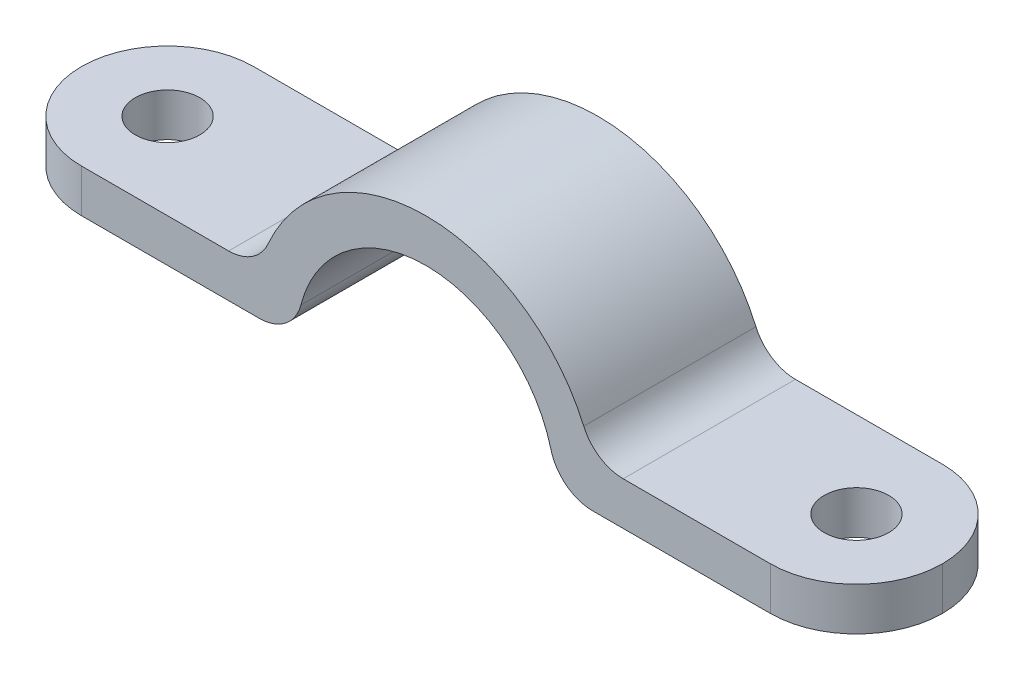
ISO-10303-21;
HEADER;
FILE_DESCRIPTION(('STEP AP214'),'2;1');
FILE_NAME('part.step','',(''),(''),'','','');
FILE_SCHEMA(('AUTOMOTIVE_DESIGN { 1 0 10303 214 1 1 1 1 }'));
ENDSEC;
DATA;
#1=APPLICATION_CONTEXT('core data for automotive mechanical design processes');
#2=APPLICATION_PROTOCOL_DEFINITION('international standard','automotive_design',2000,#1);
#3=PRODUCT_CONTEXT('',#1,'mechanical');
#4=PRODUCT('Part','Part','',(#3));
#5=PRODUCT_RELATED_PRODUCT_CATEGORY('part','',(#4));
#6=PRODUCT_DEFINITION_FORMATION('','',#4);
#7=PRODUCT_DEFINITION_CONTEXT('part definition',#1,'design');
#8=PRODUCT_DEFINITION('design','',#6,#7);
#9=PRODUCT_DEFINITION_SHAPE('','',#8);
#10=(LENGTH_UNIT() NAMED_UNIT(*) SI_UNIT(.MILLI.,.METRE.));
#11=(NAMED_UNIT(*) PLANE_ANGLE_UNIT() SI_UNIT($,.RADIAN.));
#12=(NAMED_UNIT(*) SI_UNIT($,.STERADIAN.) SOLID_ANGLE_UNIT());
#13=UNCERTAINTY_MEASURE_WITH_UNIT(LENGTH_MEASURE(1.E-05),#10,'distance_accuracy_value','');
#14=(GEOMETRIC_REPRESENTATION_CONTEXT(3) GLOBAL_UNCERTAINTY_ASSIGNED_CONTEXT((#13)) GLOBAL_UNIT_ASSIGNED_CONTEXT((#10,
#11,#12)) REPRESENTATION_CONTEXT('',''));
#15=CARTESIAN_POINT('',(0.,0.,0.));
#16=DIRECTION('',(0.,0.,1.));
#17=DIRECTION('',(1.,0.,0.));
#18=AXIS2_PLACEMENT_3D('',#15,#16,#17);
#19=CARTESIAN_POINT('',(-100.,0.,40.));
#20=DIRECTION('',(0.,1.,0.));
#21=DIRECTION('',(0.,0.,1.));
#22=AXIS2_PLACEMENT_3D('',#19,#20,#21);
#23=PLANE('',#22);
#24=CARTESIAN_POINT('',(-80.,0.,20.));
#25=DIRECTION('',(0.,1.,0.));
#26=DIRECTION('',(0.,0.,1.));
#27=AXIS2_PLACEMENT_3D('',#24,#25,#26);
#28=CIRCLE('',#27,7.5);
#29=CARTESIAN_POINT('',(-80.,0.,27.5));
#30=VERTEX_POINT('',#29);
#31=EDGE_CURVE('E243',#30,#30,#28,.T.);
#32=ORIENTED_EDGE('',*,*,#31,.T.);
#33=EDGE_LOOP('',(#32));
#34=FACE_BOUND('',#33,.T.);
#35=CARTESIAN_POINT('',(-80.,0.,20.));
#36=DIRECTION('',(0.,1.,0.));
#37=DIRECTION('',(0.,0.,1.));
#38=AXIS2_PLACEMENT_3D('',#35,#36,#37);
#39=CIRCLE('',#38,20.);
#40=CARTESIAN_POINT('',(-80.,0.,40.));
#41=VERTEX_POINT('',#40);
#42=CARTESIAN_POINT('',(-100.,0.,20.));
#43=VERTEX_POINT('',#42);
#44=EDGE_CURVE('E56',#41,#43,#39,.F.);
#45=ORIENTED_EDGE('',*,*,#44,.T.);
#46=CARTESIAN_POINT('',(-80.,0.,20.));
#47=DIRECTION('',(0.,1.,0.));
#48=DIRECTION('',(0.,0.,1.));
#49=AXIS2_PLACEMENT_3D('',#46,#47,#48);
#50=CIRCLE('',#49,20.);
#51=CARTESIAN_POINT('',(-80.,0.,0.));
#52=VERTEX_POINT('',#51);
#53=EDGE_CURVE('E232',#43,#52,#50,.F.);
#54=ORIENTED_EDGE('',*,*,#53,.T.);
#55=DIRECTION('',(1.,0.,0.));
#56=VECTOR('',#55,1.);
#57=CARTESIAN_POINT('',(-100.,0.,0.));
#58=LINE('',#57,#56);
#59=CARTESIAN_POINT('',(-38.7298334620742,0.,0.));
#60=VERTEX_POINT('',#59);
#61=EDGE_CURVE('E148',#52,#60,#58,.T.);
#62=ORIENTED_EDGE('',*,*,#61,.T.);
#63=DIRECTION('',(0.,0.,-1.));
#64=VECTOR('',#63,1.);
#65=CARTESIAN_POINT('',(-38.7298334620742,0.,40.));
#66=LINE('',#65,#64);
#67=CARTESIAN_POINT('',(-38.7298334620742,0.,40.));
#68=VERTEX_POINT('',#67);
#69=EDGE_CURVE('E146',#68,#60,#66,.T.);
#70=ORIENTED_EDGE('',*,*,#69,.F.);
#71=DIRECTION('',(1.,0.,0.));
#72=VECTOR('',#71,1.);
#73=CARTESIAN_POINT('',(-100.,0.,40.));
#74=LINE('',#73,#72);
#75=EDGE_CURVE('E133',#41,#68,#74,.T.);
#76=ORIENTED_EDGE('',*,*,#75,.F.);
#77=EDGE_LOOP('',(#45,#54,#62,#70,#76));
#78=FACE_BOUND('',#77,.T.);
#79=ADVANCED_FACE('F33',(#34,#78),#23,.F.);
#80=CARTESIAN_POINT('',(-38.7298334620742,10.,40.));
#81=DIRECTION('',(0.,0.,-1.));
#82=DIRECTION('',(-1.,0.,0.));
#83=AXIS2_PLACEMENT_3D('',#80,#81,#82);
#84=CYLINDRICAL_SURFACE('',#83,10.);
#85=CARTESIAN_POINT('',(-38.7298334620742,10.,0.));
#86=DIRECTION('',(0.,0.,1.));
#87=DIRECTION('',(-1.,0.,0.));
#88=AXIS2_PLACEMENT_3D('',#85,#86,#87);
#89=CIRCLE('',#88,10.);
#90=CARTESIAN_POINT('',(-29.0473750965556,7.5,0.));
#91=VERTEX_POINT('',#90);
#92=EDGE_CURVE('E178',#60,#91,#89,.T.);
#93=ORIENTED_EDGE('',*,*,#92,.T.);
#94=DIRECTION('',(0.,0.,-1.));
#95=VECTOR('',#94,1.);
#96=CARTESIAN_POINT('',(-29.0473750965556,7.5,40.));
#97=LINE('',#96,#95);
#98=CARTESIAN_POINT('',(-29.0473750965556,7.5,40.));
#99=VERTEX_POINT('',#98);
#100=EDGE_CURVE('E152',#99,#91,#97,.T.);
#101=ORIENTED_EDGE('',*,*,#100,.F.);
#102=CARTESIAN_POINT('',(-38.7298334620742,10.,40.));
#103=DIRECTION('',(0.,0.,1.));
#104=DIRECTION('',(-1.,0.,0.));
#105=AXIS2_PLACEMENT_3D('',#102,#103,#104);
#106=CIRCLE('',#105,10.);
#107=EDGE_CURVE('E138',#68,#99,#106,.T.);
#108=ORIENTED_EDGE('',*,*,#107,.F.);
#109=ORIENTED_EDGE('',*,*,#69,.T.);
#110=EDGE_LOOP('',(#93,#101,#108,#109));
#111=FACE_BOUND('',#110,.T.);
#112=ADVANCED_FACE('F154',(#111),#84,.T.);
#113=CARTESIAN_POINT('',(0.,0.,40.));
#114=DIRECTION('',(0.,0.,-1.));
#115=DIRECTION('',(-1.,0.,0.));
#116=AXIS2_PLACEMENT_3D('',#113,#114,#115);
#117=CYLINDRICAL_SURFACE('',#116,30.);
#118=CARTESIAN_POINT('',(0.,0.,0.));
#119=DIRECTION('',(0.,0.,-1.));
#120=DIRECTION('',(1.,0.,0.));
#121=AXIS2_PLACEMENT_3D('',#118,#119,#120);
#122=CIRCLE('',#121,30.);
#123=CARTESIAN_POINT('',(29.0473750965556,7.5,0.));
#124=VERTEX_POINT('',#123);
#125=EDGE_CURVE('E181',#91,#124,#122,.T.);
#126=ORIENTED_EDGE('',*,*,#125,.T.);
#127=DIRECTION('',(0.,0.,-1.));
#128=VECTOR('',#127,1.);
#129=CARTESIAN_POINT('',(29.0473750965556,7.5,40.));
#130=LINE('',#129,#128);
#131=CARTESIAN_POINT('',(29.0473750965556,7.5,40.));
#132=VERTEX_POINT('',#131);
#133=EDGE_CURVE('E211',#132,#124,#130,.T.);
#134=ORIENTED_EDGE('',*,*,#133,.F.);
#135=CARTESIAN_POINT('',(0.,0.,40.));
#136=DIRECTION('',(0.,0.,-1.));
#137=DIRECTION('',(1.,0.,0.));
#138=AXIS2_PLACEMENT_3D('',#135,#136,#137);
#139=CIRCLE('',#138,30.);
#140=EDGE_CURVE('E157',#99,#132,#139,.T.);
#141=ORIENTED_EDGE('',*,*,#140,.F.);
#142=ORIENTED_EDGE('',*,*,#100,.T.);
#143=EDGE_LOOP('',(#126,#134,#141,#142));
#144=FACE_BOUND('',#143,.T.);
#145=ADVANCED_FACE('F289',(#144),#117,.F.);
#146=CARTESIAN_POINT('',(38.7298334620742,10.,40.));
#147=DIRECTION('',(0.,0.,-1.));
#148=DIRECTION('',(-1.,0.,0.));
#149=AXIS2_PLACEMENT_3D('',#146,#147,#148);
#150=CYLINDRICAL_SURFACE('',#149,10.);
#151=CARTESIAN_POINT('',(38.7298334620742,10.,0.));
#152=DIRECTION('',(0.,0.,1.));
#153=DIRECTION('',(1.,0.,0.));
#154=AXIS2_PLACEMENT_3D('',#151,#152,#153);
#155=CIRCLE('',#154,10.);
#156=CARTESIAN_POINT('',(38.7298334620742,0.,0.));
#157=VERTEX_POINT('',#156);
#158=EDGE_CURVE('E183',#124,#157,#155,.T.);
#159=ORIENTED_EDGE('',*,*,#158,.T.);
#160=DIRECTION('',(0.,0.,-1.));
#161=VECTOR('',#160,1.);
#162=CARTESIAN_POINT('',(38.7298334620742,0.,40.));
#163=LINE('',#162,#161);
#164=CARTESIAN_POINT('',(38.7298334620742,0.,40.));
#165=VERTEX_POINT('',#164);
#166=EDGE_CURVE('E208',#165,#157,#163,.T.);
#167=ORIENTED_EDGE('',*,*,#166,.F.);
#168=CARTESIAN_POINT('',(38.7298334620742,10.,40.));
#169=DIRECTION('',(0.,0.,1.));
#170=DIRECTION('',(1.,0.,0.));
#171=AXIS2_PLACEMENT_3D('',#168,#169,#170);
#172=CIRCLE('',#171,10.);
#173=EDGE_CURVE('E159',#132,#165,#172,.T.);
#174=ORIENTED_EDGE('',*,*,#173,.F.);
#175=ORIENTED_EDGE('',*,*,#133,.T.);
#176=EDGE_LOOP('',(#159,#167,#174,#175));
#177=FACE_BOUND('',#176,.T.);
#178=ADVANCED_FACE('F335',(#177),#150,.T.);
#179=CARTESIAN_POINT('',(38.7298334620742,0.,40.));
#180=DIRECTION('',(0.,1.,0.));
#181=DIRECTION('',(0.,0.,1.));
#182=AXIS2_PLACEMENT_3D('',#179,#180,#181);
#183=PLANE('',#182);
#184=CARTESIAN_POINT('',(80.,0.,20.));
#185=DIRECTION('',(0.,1.,0.));
#186=DIRECTION('',(0.,0.,1.));
#187=AXIS2_PLACEMENT_3D('',#184,#185,#186);
#188=CIRCLE('',#187,7.5);
#189=CARTESIAN_POINT('',(80.,0.,27.5));
#190=VERTEX_POINT('',#189);
#191=EDGE_CURVE('E239',#190,#190,#188,.T.);
#192=ORIENTED_EDGE('',*,*,#191,.T.);
#193=EDGE_LOOP('',(#192));
#194=FACE_BOUND('',#193,.T.);
#195=DIRECTION('',(1.,0.,0.));
#196=VECTOR('',#195,1.);
#197=CARTESIAN_POINT('',(38.7298334620742,0.,0.));
#198=LINE('',#197,#196);
#199=CARTESIAN_POINT('',(80.,0.,0.));
#200=VERTEX_POINT('',#199);
#201=EDGE_CURVE('E185',#157,#200,#198,.T.);
#202=ORIENTED_EDGE('',*,*,#201,.T.);
#203=CARTESIAN_POINT('',(80.,0.,20.));
#204=DIRECTION('',(0.,1.,0.));
#205=DIRECTION('',(0.,0.,1.));
#206=AXIS2_PLACEMENT_3D('',#203,#204,#205);
#207=CIRCLE('',#206,20.);
#208=CARTESIAN_POINT('',(100.,0.,20.));
#209=VERTEX_POINT('',#208);
#210=EDGE_CURVE('E226',#200,#209,#207,.F.);
#211=ORIENTED_EDGE('',*,*,#210,.T.);
#212=CARTESIAN_POINT('',(80.,0.,20.));
#213=DIRECTION('',(0.,1.,0.));
#214=DIRECTION('',(0.,0.,1.));
#215=AXIS2_PLACEMENT_3D('',#212,#213,#214);
#216=CIRCLE('',#215,20.);
#217=CARTESIAN_POINT('',(80.,0.,40.));
#218=VERTEX_POINT('',#217);
#219=EDGE_CURVE('E224',#209,#218,#216,.F.);
#220=ORIENTED_EDGE('',*,*,#219,.T.);
#221=DIRECTION('',(1.,0.,0.));
#222=VECTOR('',#221,1.);
#223=CARTESIAN_POINT('',(38.7298334620742,0.,40.));
#224=LINE('',#223,#222);
#225=EDGE_CURVE('E164',#165,#218,#224,.T.);
#226=ORIENTED_EDGE('',*,*,#225,.F.);
#227=ORIENTED_EDGE('',*,*,#166,.T.);
#228=EDGE_LOOP('',(#202,#211,#220,#226,#227));
#229=FACE_BOUND('',#228,.T.);
#230=ADVANCED_FACE('F331',(#194,#229),#183,.F.);
#231=CARTESIAN_POINT('',(45.8257569495584,10.,40.));
#232=DIRECTION('',(0.,-1.,0.));
#233=DIRECTION('',(0.,0.,-1.));
#234=AXIS2_PLACEMENT_3D('',#231,#232,#233);
#235=PLANE('',#234);
#236=CARTESIAN_POINT('',(80.,10.,20.));
#237=DIRECTION('',(0.,1.,0.));
#238=DIRECTION('',(0.,0.,1.));
#239=AXIS2_PLACEMENT_3D('',#236,#237,#238);
#240=CIRCLE('',#239,7.5);
#241=CARTESIAN_POINT('',(80.,10.,27.5));
#242=VERTEX_POINT('',#241);
#243=EDGE_CURVE('E250',#242,#242,#240,.T.);
#244=ORIENTED_EDGE('',*,*,#243,.F.);
#245=EDGE_LOOP('',(#244));
#246=FACE_BOUND('',#245,.T.);
#247=CARTESIAN_POINT('',(80.,10.,20.));
#248=DIRECTION('',(0.,-1.,0.));
#249=DIRECTION('',(0.,0.,-1.));
#250=AXIS2_PLACEMENT_3D('',#247,#248,#249);
#251=CIRCLE('',#250,20.);
#252=CARTESIAN_POINT('',(80.,10.,40.));
#253=VERTEX_POINT('',#252);
#254=CARTESIAN_POINT('',(100.,10.,20.));
#255=VERTEX_POINT('',#254);
#256=EDGE_CURVE('E151',#253,#255,#251,.F.);
#257=ORIENTED_EDGE('',*,*,#256,.T.);
#258=CARTESIAN_POINT('',(80.,10.,20.));
#259=DIRECTION('',(0.,-1.,0.));
#260=DIRECTION('',(0.,0.,-1.));
#261=AXIS2_PLACEMENT_3D('',#258,#259,#260);
#262=CIRCLE('',#261,20.);
#263=CARTESIAN_POINT('',(80.,10.,0.));
#264=VERTEX_POINT('',#263);
#265=EDGE_CURVE('E216',#255,#264,#262,.F.);
#266=ORIENTED_EDGE('',*,*,#265,.T.);
#267=DIRECTION('',(-1.,0.,0.));
#268=VECTOR('',#267,1.);
#269=CARTESIAN_POINT('',(45.8257569495584,10.,0.));
#270=LINE('',#269,#268);
#271=CARTESIAN_POINT('',(45.8257569495584,10.,0.));
#272=VERTEX_POINT('',#271);
#273=EDGE_CURVE('E188',#264,#272,#270,.T.);
#274=ORIENTED_EDGE('',*,*,#273,.T.);
#275=DIRECTION('',(0.,0.,-1.));
#276=VECTOR('',#275,1.);
#277=CARTESIAN_POINT('',(45.8257569495584,10.,40.));
#278=LINE('',#277,#276);
#279=CARTESIAN_POINT('',(45.8257569495584,10.,40.));
#280=VERTEX_POINT('',#279);
#281=EDGE_CURVE('E205',#280,#272,#278,.T.);
#282=ORIENTED_EDGE('',*,*,#281,.F.);
#283=DIRECTION('',(-1.,0.,0.));
#284=VECTOR('',#283,1.);
#285=CARTESIAN_POINT('',(45.8257569495584,10.,40.));
#286=LINE('',#285,#284);
#287=EDGE_CURVE('E166',#253,#280,#286,.T.);
#288=ORIENTED_EDGE('',*,*,#287,.F.);
#289=EDGE_LOOP('',(#257,#266,#274,#282,#288));
#290=FACE_BOUND('',#289,.T.);
#291=ADVANCED_FACE('F308',(#246,#290),#235,.F.);
#292=CARTESIAN_POINT('',(45.8257569495584,20.,40.));
#293=DIRECTION('',(0.,0.,-1.));
#294=DIRECTION('',(-1.,0.,0.));
#295=AXIS2_PLACEMENT_3D('',#292,#293,#294);
#296=CYLINDRICAL_SURFACE('',#295,10.);
#297=CARTESIAN_POINT('',(45.8257569495584,20.,0.));
#298=DIRECTION('',(0.,0.,-1.));
#299=DIRECTION('',(1.,0.,0.));
#300=AXIS2_PLACEMENT_3D('',#297,#298,#299);
#301=CIRCLE('',#300,10.);
#302=CARTESIAN_POINT('',(36.6606055596467,16.,0.));
#303=VERTEX_POINT('',#302);
#304=EDGE_CURVE('E190',#272,#303,#301,.T.);
#305=ORIENTED_EDGE('',*,*,#304,.T.);
#306=DIRECTION('',(0.,0.,-1.));
#307=VECTOR('',#306,1.);
#308=CARTESIAN_POINT('',(36.6606055596467,16.,40.));
#309=LINE('',#308,#307);
#310=CARTESIAN_POINT('',(36.6606055596467,16.,40.));
#311=VERTEX_POINT('',#310);
#312=EDGE_CURVE('E202',#311,#303,#309,.T.);
#313=ORIENTED_EDGE('',*,*,#312,.F.);
#314=CARTESIAN_POINT('',(45.8257569495584,20.,40.));
#315=DIRECTION('',(0.,0.,-1.));
#316=DIRECTION('',(1.,0.,0.));
#317=AXIS2_PLACEMENT_3D('',#314,#315,#316);
#318=CIRCLE('',#317,10.);
#319=EDGE_CURVE('E168',#280,#311,#318,.T.);
#320=ORIENTED_EDGE('',*,*,#319,.F.);
#321=ORIENTED_EDGE('',*,*,#281,.T.);
#322=EDGE_LOOP('',(#305,#313,#320,#321));
#323=FACE_BOUND('',#322,.T.);
#324=ADVANCED_FACE('F313',(#323),#296,.F.);
#325=CARTESIAN_POINT('',(0.,0.,40.));
#326=DIRECTION('',(0.,0.,-1.));
#327=DIRECTION('',(-1.,0.,0.));
#328=AXIS2_PLACEMENT_3D('',#325,#326,#327);
#329=CYLINDRICAL_SURFACE('',#328,40.);
#330=CARTESIAN_POINT('',(0.,0.,0.));
#331=DIRECTION('',(0.,0.,1.));
#332=DIRECTION('',(1.,0.,0.));
#333=AXIS2_PLACEMENT_3D('',#330,#331,#332);
#334=CIRCLE('',#333,40.);
#335=CARTESIAN_POINT('',(-36.6606055596467,16.,0.));
#336=VERTEX_POINT('',#335);
#337=EDGE_CURVE('E192',#303,#336,#334,.T.);
#338=ORIENTED_EDGE('',*,*,#337,.T.);
#339=DIRECTION('',(0.,0.,-1.));
#340=VECTOR('',#339,1.);
#341=CARTESIAN_POINT('',(-36.6606055596467,16.,40.));
#342=LINE('',#341,#340);
#343=CARTESIAN_POINT('',(-36.6606055596467,16.,40.));
#344=VERTEX_POINT('',#343);
#345=EDGE_CURVE('E199',#344,#336,#342,.T.);
#346=ORIENTED_EDGE('',*,*,#345,.F.);
#347=CARTESIAN_POINT('',(0.,0.,40.));
#348=DIRECTION('',(0.,0.,1.));
#349=DIRECTION('',(1.,0.,0.));
#350=AXIS2_PLACEMENT_3D('',#347,#348,#349);
#351=CIRCLE('',#350,40.);
#352=EDGE_CURVE('E170',#311,#344,#351,.T.);
#353=ORIENTED_EDGE('',*,*,#352,.F.);
#354=ORIENTED_EDGE('',*,*,#312,.T.);
#355=EDGE_LOOP('',(#338,#346,#353,#354));
#356=FACE_BOUND('',#355,.T.);
#357=ADVANCED_FACE('F318',(#356),#329,.T.);
#358=CARTESIAN_POINT('',(-45.8257569495584,20.,40.));
#359=DIRECTION('',(0.,0.,-1.));
#360=DIRECTION('',(-1.,0.,0.));
#361=AXIS2_PLACEMENT_3D('',#358,#359,#360);
#362=CYLINDRICAL_SURFACE('',#361,10.);
#363=CARTESIAN_POINT('',(-45.8257569495584,20.,0.));
#364=DIRECTION('',(0.,0.,-1.));
#365=DIRECTION('',(1.,0.,0.));
#366=AXIS2_PLACEMENT_3D('',#363,#364,#365);
#367=CIRCLE('',#366,10.);
#368=CARTESIAN_POINT('',(-45.8257569495584,10.,0.));
#369=VERTEX_POINT('',#368);
#370=EDGE_CURVE('E194',#336,#369,#367,.T.);
#371=ORIENTED_EDGE('',*,*,#370,.T.);
#372=DIRECTION('',(0.,0.,-1.));
#373=VECTOR('',#372,1.);
#374=CARTESIAN_POINT('',(-45.8257569495584,10.,40.));
#375=LINE('',#374,#373);
#376=CARTESIAN_POINT('',(-45.8257569495584,10.,40.));
#377=VERTEX_POINT('',#376);
#378=EDGE_CURVE('E176',#377,#369,#375,.T.);
#379=ORIENTED_EDGE('',*,*,#378,.F.);
#380=CARTESIAN_POINT('',(-45.8257569495584,20.,40.));
#381=DIRECTION('',(0.,0.,-1.));
#382=DIRECTION('',(1.,0.,0.));
#383=AXIS2_PLACEMENT_3D('',#380,#381,#382);
#384=CIRCLE('',#383,10.);
#385=EDGE_CURVE('E172',#344,#377,#384,.T.);
#386=ORIENTED_EDGE('',*,*,#385,.F.);
#387=ORIENTED_EDGE('',*,*,#345,.T.);
#388=EDGE_LOOP('',(#371,#379,#386,#387));
#389=FACE_BOUND('',#388,.T.);
#390=ADVANCED_FACE('F261',(#389),#362,.F.);
#391=CARTESIAN_POINT('',(-100.,10.,40.));
#392=DIRECTION('',(0.,-1.,0.));
#393=DIRECTION('',(0.,0.,-1.));
#394=AXIS2_PLACEMENT_3D('',#391,#392,#393);
#395=PLANE('',#394);
#396=CARTESIAN_POINT('',(-80.,10.,20.));
#397=DIRECTION('',(0.,1.,0.));
#398=DIRECTION('',(0.,0.,1.));
#399=AXIS2_PLACEMENT_3D('',#396,#397,#398);
#400=CIRCLE('',#399,7.5);
#401=CARTESIAN_POINT('',(-80.,10.,27.5));
#402=VERTEX_POINT('',#401);
#403=EDGE_CURVE('E247',#402,#402,#400,.T.);
#404=ORIENTED_EDGE('',*,*,#403,.F.);
#405=EDGE_LOOP('',(#404));
#406=FACE_BOUND('',#405,.T.);
#407=DIRECTION('',(-1.,0.,0.));
#408=VECTOR('',#407,1.);
#409=CARTESIAN_POINT('',(-100.,10.,0.));
#410=LINE('',#409,#408);
#411=CARTESIAN_POINT('',(-80.,10.,0.));
#412=VERTEX_POINT('',#411);
#413=EDGE_CURVE('E143',#369,#412,#410,.T.);
#414=ORIENTED_EDGE('',*,*,#413,.T.);
#415=CARTESIAN_POINT('',(-80.,10.,20.));
#416=DIRECTION('',(0.,-1.,0.));
#417=DIRECTION('',(0.,0.,-1.));
#418=AXIS2_PLACEMENT_3D('',#415,#416,#417);
#419=CIRCLE('',#418,20.);
#420=CARTESIAN_POINT('',(-100.,10.,20.));
#421=VERTEX_POINT('',#420);
#422=EDGE_CURVE('E11',#412,#421,#419,.F.);
#423=ORIENTED_EDGE('',*,*,#422,.T.);
#424=CARTESIAN_POINT('',(-80.,10.,20.));
#425=DIRECTION('',(0.,-1.,0.));
#426=DIRECTION('',(0.,0.,-1.));
#427=AXIS2_PLACEMENT_3D('',#424,#425,#426);
#428=CIRCLE('',#427,20.);
#429=CARTESIAN_POINT('',(-80.,10.,40.));
#430=VERTEX_POINT('',#429);
#431=EDGE_CURVE('E42',#421,#430,#428,.F.);
#432=ORIENTED_EDGE('',*,*,#431,.T.);
#433=DIRECTION('',(-1.,0.,0.));
#434=VECTOR('',#433,1.);
#435=CARTESIAN_POINT('',(-100.,10.,40.));
#436=LINE('',#435,#434);
#437=EDGE_CURVE('E174',#377,#430,#436,.T.);
#438=ORIENTED_EDGE('',*,*,#437,.F.);
#439=ORIENTED_EDGE('',*,*,#378,.T.);
#440=EDGE_LOOP('',(#414,#423,#432,#438,#439));
#441=FACE_BOUND('',#440,.T.);
#442=ADVANCED_FACE('F259',(#406,#441),#395,.F.);
#443=CARTESIAN_POINT('',(-38.7298334620742,10.,40.));
#444=DIRECTION('',(0.,0.,-1.));
#445=DIRECTION('',(-1.,0.,0.));
#446=AXIS2_PLACEMENT_3D('',#443,#444,#445);
#447=PLANE('',#446);
#448=ORIENTED_EDGE('',*,*,#225,.T.);
#449=DIRECTION('',(0.,1.,0.));
#450=VECTOR('',#449,1.);
#451=CARTESIAN_POINT('',(80.,10.,40.));
#452=LINE('',#451,#450);
#453=EDGE_CURVE('E229',#218,#253,#452,.T.);
#454=ORIENTED_EDGE('',*,*,#453,.T.);
#455=ORIENTED_EDGE('',*,*,#287,.T.);
#456=ORIENTED_EDGE('',*,*,#319,.T.);
#457=ORIENTED_EDGE('',*,*,#352,.T.);
#458=ORIENTED_EDGE('',*,*,#385,.T.);
#459=ORIENTED_EDGE('',*,*,#437,.T.);
#460=DIRECTION('',(0.,-1.,0.));
#461=VECTOR('',#460,1.);
#462=CARTESIAN_POINT('',(-80.,10.,40.));
#463=LINE('',#462,#461);
#464=EDGE_CURVE('E142',#430,#41,#463,.T.);
#465=ORIENTED_EDGE('',*,*,#464,.T.);
#466=ORIENTED_EDGE('',*,*,#75,.T.);
#467=ORIENTED_EDGE('',*,*,#107,.T.);
#468=ORIENTED_EDGE('',*,*,#140,.T.);
#469=ORIENTED_EDGE('',*,*,#173,.T.);
#470=EDGE_LOOP('',(#448,#454,#455,#456,#457,#458,#459,#465,#466,#467,#468,#469));
#471=FACE_BOUND('',#470,.T.);
#472=ADVANCED_FACE('F136',(#471),#447,.F.);
#473=CARTESIAN_POINT('',(-38.7298334620742,10.,0.));
#474=DIRECTION('',(0.,0.,-1.));
#475=DIRECTION('',(-1.,0.,0.));
#476=AXIS2_PLACEMENT_3D('',#473,#474,#475);
#477=PLANE('',#476);
#478=ORIENTED_EDGE('',*,*,#273,.F.);
#479=DIRECTION('',(0.,1.,0.));
#480=VECTOR('',#479,1.);
#481=CARTESIAN_POINT('',(80.,0.,0.));
#482=LINE('',#481,#480);
#483=EDGE_CURVE('E221',#264,#200,#482,.F.);
#484=ORIENTED_EDGE('',*,*,#483,.T.);
#485=ORIENTED_EDGE('',*,*,#201,.F.);
#486=ORIENTED_EDGE('',*,*,#158,.F.);
#487=ORIENTED_EDGE('',*,*,#125,.F.);
#488=ORIENTED_EDGE('',*,*,#92,.F.);
#489=ORIENTED_EDGE('',*,*,#61,.F.);
#490=DIRECTION('',(0.,-1.,0.));
#491=VECTOR('',#490,1.);
#492=CARTESIAN_POINT('',(-80.,10.,0.));
#493=LINE('',#492,#491);
#494=EDGE_CURVE('E218',#52,#412,#493,.F.);
#495=ORIENTED_EDGE('',*,*,#494,.T.);
#496=ORIENTED_EDGE('',*,*,#413,.F.);
#497=ORIENTED_EDGE('',*,*,#370,.F.);
#498=ORIENTED_EDGE('',*,*,#337,.F.);
#499=ORIENTED_EDGE('',*,*,#304,.F.);
#500=EDGE_LOOP('',(#478,#484,#485,#486,#487,#488,#489,#495,#496,#497,#498,#499));
#501=FACE_BOUND('',#500,.T.);
#502=ADVANCED_FACE('F269',(#501),#477,.T.);
#503=CARTESIAN_POINT('',(80.,10.,20.));
#504=DIRECTION('',(0.,1.,0.));
#505=DIRECTION('',(0.,0.,1.));
#506=AXIS2_PLACEMENT_3D('',#503,#504,#505);
#507=CYLINDRICAL_SURFACE('',#506,20.);
#508=ORIENTED_EDGE('',*,*,#453,.F.);
#509=ORIENTED_EDGE('',*,*,#219,.F.);
#510=DIRECTION('',(0.,1.,0.));
#511=VECTOR('',#510,1.);
#512=CARTESIAN_POINT('',(100.,10.,20.));
#513=LINE('',#512,#511);
#514=EDGE_CURVE('E179',#255,#209,#513,.F.);
#515=ORIENTED_EDGE('',*,*,#514,.F.);
#516=ORIENTED_EDGE('',*,*,#256,.F.);
#517=EDGE_LOOP('',(#508,#509,#515,#516));
#518=FACE_BOUND('',#517,.T.);
#519=ADVANCED_FACE('F294',(#518),#507,.T.);
#520=CARTESIAN_POINT('',(80.,10.,20.));
#521=DIRECTION('',(0.,-1.,0.));
#522=DIRECTION('',(0.,0.,-1.));
#523=AXIS2_PLACEMENT_3D('',#520,#521,#522);
#524=CYLINDRICAL_SURFACE('',#523,20.);
#525=ORIENTED_EDGE('',*,*,#210,.F.);
#526=ORIENTED_EDGE('',*,*,#483,.F.);
#527=ORIENTED_EDGE('',*,*,#265,.F.);
#528=ORIENTED_EDGE('',*,*,#514,.T.);
#529=EDGE_LOOP('',(#525,#526,#527,#528));
#530=FACE_BOUND('',#529,.T.);
#531=ADVANCED_FACE('F280',(#530),#524,.T.);
#532=CARTESIAN_POINT('',(-80.,10.,20.));
#533=DIRECTION('',(0.,-1.,0.));
#534=DIRECTION('',(0.,0.,-1.));
#535=AXIS2_PLACEMENT_3D('',#532,#533,#534);
#536=CYLINDRICAL_SURFACE('',#535,20.);
#537=ORIENTED_EDGE('',*,*,#464,.F.);
#538=ORIENTED_EDGE('',*,*,#431,.F.);
#539=DIRECTION('',(0.,-1.,0.));
#540=VECTOR('',#539,1.);
#541=CARTESIAN_POINT('',(-100.,10.,20.));
#542=LINE('',#541,#540);
#543=EDGE_CURVE('E37',#43,#421,#542,.F.);
#544=ORIENTED_EDGE('',*,*,#543,.F.);
#545=ORIENTED_EDGE('',*,*,#44,.F.);
#546=EDGE_LOOP('',(#537,#538,#544,#545));
#547=FACE_BOUND('',#546,.T.);
#548=ADVANCED_FACE('F35',(#547),#536,.T.);
#549=CARTESIAN_POINT('',(-80.,10.,20.));
#550=DIRECTION('',(0.,1.,0.));
#551=DIRECTION('',(0.,0.,1.));
#552=AXIS2_PLACEMENT_3D('',#549,#550,#551);
#553=CYLINDRICAL_SURFACE('',#552,20.);
#554=ORIENTED_EDGE('',*,*,#422,.F.);
#555=ORIENTED_EDGE('',*,*,#494,.F.);
#556=ORIENTED_EDGE('',*,*,#53,.F.);
#557=ORIENTED_EDGE('',*,*,#543,.T.);
#558=EDGE_LOOP('',(#554,#555,#556,#557));
#559=FACE_BOUND('',#558,.T.);
#560=ADVANCED_FACE('F272',(#559),#553,.T.);
#561=CARTESIAN_POINT('',(-80.,-30.,20.));
#562=DIRECTION('',(0.,1.,0.));
#563=DIRECTION('',(0.,0.,1.));
#564=AXIS2_PLACEMENT_3D('',#561,#562,#563);
#565=CYLINDRICAL_SURFACE('',#564,7.5);
#566=ORIENTED_EDGE('',*,*,#403,.T.);
#567=EDGE_LOOP('',(#566));
#568=FACE_BOUND('',#567,.T.);
#569=ORIENTED_EDGE('',*,*,#31,.F.);
#570=EDGE_LOOP('',(#569));
#571=FACE_BOUND('',#570,.T.);
#572=ADVANCED_FACE('F256',(#568,#571),#565,.F.);
#573=CARTESIAN_POINT('',(80.,-30.,20.));
#574=DIRECTION('',(0.,1.,0.));
#575=DIRECTION('',(0.,0.,1.));
#576=AXIS2_PLACEMENT_3D('',#573,#574,#575);
#577=CYLINDRICAL_SURFACE('',#576,7.5);
#578=ORIENTED_EDGE('',*,*,#243,.T.);
#579=EDGE_LOOP('',(#578));
#580=FACE_BOUND('',#579,.T.);
#581=ORIENTED_EDGE('',*,*,#191,.F.);
#582=EDGE_LOOP('',(#581));
#583=FACE_BOUND('',#582,.T.);
#584=ADVANCED_FACE('F278',(#580,#583),#577,.F.);
#585=CLOSED_SHELL('',(#79,#112,#145,#178,#230,#291,#324,#357,#390,#442,#472,#502,#519,#531,#548,
#560,#572,#584));
#586=MANIFOLD_SOLID_BREP('B2',#585);
#587=ADVANCED_BREP_SHAPE_REPRESENTATION('',(#18,#586),#14);
#588=SHAPE_DEFINITION_REPRESENTATION(#9,#587);
ENDSEC;
END-ISO-10303-21;
